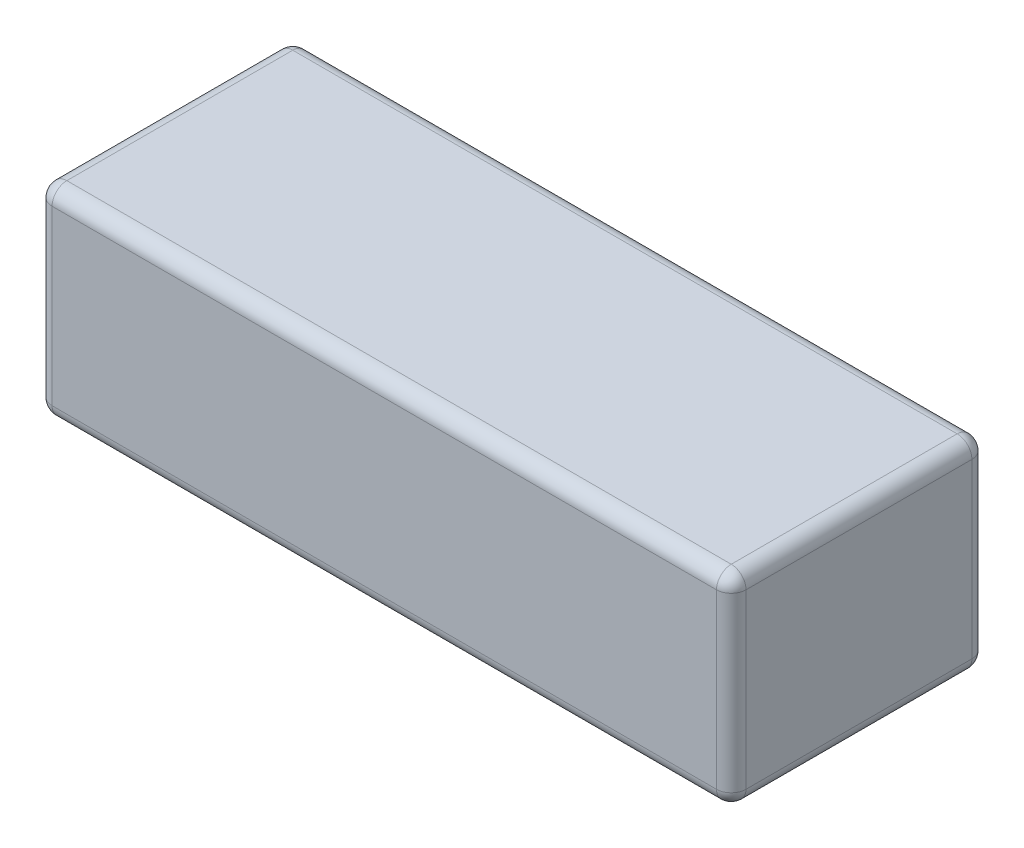
ISO-10303-21;
HEADER;
FILE_DESCRIPTION(('STEP AP214'),'2;1');
FILE_NAME('part.step','',(''),(''),'','','');
FILE_SCHEMA(('AUTOMOTIVE_DESIGN { 1 0 10303 214 1 1 1 1 }'));
ENDSEC;
DATA;
#1=APPLICATION_CONTEXT('core data for automotive mechanical design processes');
#2=APPLICATION_PROTOCOL_DEFINITION('international standard','automotive_design',2000,#1);
#3=PRODUCT_CONTEXT('',#1,'mechanical');
#4=PRODUCT('Part','Part','',(#3));
#5=PRODUCT_RELATED_PRODUCT_CATEGORY('part','',(#4));
#6=PRODUCT_DEFINITION_FORMATION('','',#4);
#7=PRODUCT_DEFINITION_CONTEXT('part definition',#1,'design');
#8=PRODUCT_DEFINITION('design','',#6,#7);
#9=PRODUCT_DEFINITION_SHAPE('','',#8);
#10=(LENGTH_UNIT() NAMED_UNIT(*) SI_UNIT(.MILLI.,.METRE.));
#11=(NAMED_UNIT(*) PLANE_ANGLE_UNIT() SI_UNIT($,.RADIAN.));
#12=(NAMED_UNIT(*) SI_UNIT($,.STERADIAN.) SOLID_ANGLE_UNIT());
#13=UNCERTAINTY_MEASURE_WITH_UNIT(LENGTH_MEASURE(1.E-05),#10,'distance_accuracy_value','');
#14=(GEOMETRIC_REPRESENTATION_CONTEXT(3) GLOBAL_UNCERTAINTY_ASSIGNED_CONTEXT((#13)) GLOBAL_UNIT_ASSIGNED_CONTEXT((#10,
#11,#12)) REPRESENTATION_CONTEXT('',''));
#15=CARTESIAN_POINT('',(0.,0.,0.));
#16=DIRECTION('',(0.,0.,1.));
#17=DIRECTION('',(1.,0.,0.));
#18=AXIS2_PLACEMENT_3D('',#15,#16,#17);
#19=CARTESIAN_POINT('',(23.5,13.7,8.65));
#20=DIRECTION('',(-1.,0.,0.));
#21=DIRECTION('',(0.,0.,1.));
#22=AXIS2_PLACEMENT_3D('',#19,#20,#21);
#23=PLANE('',#22);
#24=DIRECTION('',(0.,0.,-1.));
#25=VECTOR('',#24,1.);
#26=CARTESIAN_POINT('',(23.5,12.7,8.65));
#27=LINE('',#26,#25);
#28=CARTESIAN_POINT('',(23.5,12.7,-7.65));
#29=VERTEX_POINT('',#28);
#30=CARTESIAN_POINT('',(23.5,12.7,7.65));
#31=VERTEX_POINT('',#30);
#32=EDGE_CURVE('E132',#29,#31,#27,.F.);
#33=ORIENTED_EDGE('',*,*,#32,.T.);
#34=DIRECTION('',(0.,-1.,0.));
#35=VECTOR('',#34,1.);
#36=CARTESIAN_POINT('',(23.5,13.7,7.65));
#37=LINE('',#36,#35);
#38=CARTESIAN_POINT('',(23.5,0.999999999999999,7.65));
#39=VERTEX_POINT('',#38);
#40=EDGE_CURVE('E128',#31,#39,#37,.T.);
#41=ORIENTED_EDGE('',*,*,#40,.T.);
#42=DIRECTION('',(0.,0.,-1.));
#43=VECTOR('',#42,1.);
#44=CARTESIAN_POINT('',(23.5,0.999999999999999,-8.65));
#45=LINE('',#44,#43);
#46=CARTESIAN_POINT('',(23.5,0.999999999999999,-7.65));
#47=VERTEX_POINT('',#46);
#48=EDGE_CURVE('E123',#39,#47,#45,.T.);
#49=ORIENTED_EDGE('',*,*,#48,.T.);
#50=DIRECTION('',(0.,-1.,0.));
#51=VECTOR('',#50,1.);
#52=CARTESIAN_POINT('',(23.5,13.7,-7.65));
#53=LINE('',#52,#51);
#54=EDGE_CURVE('E125',#47,#29,#53,.F.);
#55=ORIENTED_EDGE('',*,*,#54,.T.);
#56=EDGE_LOOP('',(#33,#41,#49,#55));
#57=FACE_BOUND('',#56,.T.);
#58=ADVANCED_FACE('F34',(#57),#23,.F.);
#59=CARTESIAN_POINT('',(-23.5,13.7,-8.65));
#60=DIRECTION('',(0.,0.,1.));
#61=DIRECTION('',(1.,0.,0.));
#62=AXIS2_PLACEMENT_3D('',#59,#60,#61);
#63=PLANE('',#62);
#64=DIRECTION('',(-1.,0.,0.));
#65=VECTOR('',#64,1.);
#66=CARTESIAN_POINT('',(-23.5,12.7,-8.65));
#67=LINE('',#66,#65);
#68=CARTESIAN_POINT('',(-22.5,12.7,-8.65));
#69=VERTEX_POINT('',#68);
#70=CARTESIAN_POINT('',(22.5,12.7,-8.65));
#71=VERTEX_POINT('',#70);
#72=EDGE_CURVE('E43',#69,#71,#67,.F.);
#73=ORIENTED_EDGE('',*,*,#72,.T.);
#74=DIRECTION('',(0.,-1.,0.));
#75=VECTOR('',#74,1.);
#76=CARTESIAN_POINT('',(22.5,13.7,-8.65));
#77=LINE('',#76,#75);
#78=CARTESIAN_POINT('',(22.5,0.999999999999999,-8.65));
#79=VERTEX_POINT('',#78);
#80=EDGE_CURVE('E11',#71,#79,#77,.T.);
#81=ORIENTED_EDGE('',*,*,#80,.T.);
#82=DIRECTION('',(-1.,0.,0.));
#83=VECTOR('',#82,1.);
#84=CARTESIAN_POINT('',(-23.5,0.999999999999999,-8.65));
#85=LINE('',#84,#83);
#86=CARTESIAN_POINT('',(-22.5,0.999999999999999,-8.65));
#87=VERTEX_POINT('',#86);
#88=EDGE_CURVE('E234',#79,#87,#85,.T.);
#89=ORIENTED_EDGE('',*,*,#88,.T.);
#90=DIRECTION('',(0.,-1.,0.));
#91=VECTOR('',#90,1.);
#92=CARTESIAN_POINT('',(-22.5,13.7,-8.65));
#93=LINE('',#92,#91);
#94=EDGE_CURVE('E54',#87,#69,#93,.F.);
#95=ORIENTED_EDGE('',*,*,#94,.T.);
#96=EDGE_LOOP('',(#73,#81,#89,#95));
#97=FACE_BOUND('',#96,.T.);
#98=ADVANCED_FACE('F307',(#97),#63,.F.);
#99=CARTESIAN_POINT('',(-23.5,13.7,8.65));
#100=DIRECTION('',(1.,0.,0.));
#101=DIRECTION('',(0.,0.,-1.));
#102=AXIS2_PLACEMENT_3D('',#99,#100,#101);
#103=PLANE('',#102);
#104=DIRECTION('',(0.,0.,1.));
#105=VECTOR('',#104,1.);
#106=CARTESIAN_POINT('',(-23.5,0.999999999999999,8.65));
#107=LINE('',#106,#105);
#108=CARTESIAN_POINT('',(-23.5,0.999999999999999,-7.65));
#109=VERTEX_POINT('',#108);
#110=CARTESIAN_POINT('',(-23.5,0.999999999999999,7.65));
#111=VERTEX_POINT('',#110);
#112=EDGE_CURVE('E280',#109,#111,#107,.T.);
#113=ORIENTED_EDGE('',*,*,#112,.T.);
#114=DIRECTION('',(0.,-1.,0.));
#115=VECTOR('',#114,1.);
#116=CARTESIAN_POINT('',(-23.5,13.7,7.65));
#117=LINE('',#116,#115);
#118=CARTESIAN_POINT('',(-23.5,12.7,7.65));
#119=VERTEX_POINT('',#118);
#120=EDGE_CURVE('E283',#111,#119,#117,.F.);
#121=ORIENTED_EDGE('',*,*,#120,.T.);
#122=DIRECTION('',(0.,0.,1.));
#123=VECTOR('',#122,1.);
#124=CARTESIAN_POINT('',(-23.5,12.7,8.65));
#125=LINE('',#124,#123);
#126=CARTESIAN_POINT('',(-23.5,12.7,-7.65));
#127=VERTEX_POINT('',#126);
#128=EDGE_CURVE('E212',#119,#127,#125,.F.);
#129=ORIENTED_EDGE('',*,*,#128,.T.);
#130=DIRECTION('',(0.,-1.,0.));
#131=VECTOR('',#130,1.);
#132=CARTESIAN_POINT('',(-23.5,13.7,-7.65));
#133=LINE('',#132,#131);
#134=EDGE_CURVE('E264',#127,#109,#133,.T.);
#135=ORIENTED_EDGE('',*,*,#134,.T.);
#136=EDGE_LOOP('',(#113,#121,#129,#135));
#137=FACE_BOUND('',#136,.T.);
#138=ADVANCED_FACE('F312',(#137),#103,.F.);
#139=CARTESIAN_POINT('',(-23.5,13.7,8.65));
#140=DIRECTION('',(0.,0.,-1.));
#141=DIRECTION('',(-1.,0.,0.));
#142=AXIS2_PLACEMENT_3D('',#139,#140,#141);
#143=PLANE('',#142);
#144=DIRECTION('',(0.,-1.,0.));
#145=VECTOR('',#144,1.);
#146=CARTESIAN_POINT('',(22.5,13.7,8.65));
#147=LINE('',#146,#145);
#148=CARTESIAN_POINT('',(22.5,0.999999999999999,8.65));
#149=VERTEX_POINT('',#148);
#150=CARTESIAN_POINT('',(22.5,12.7,8.65));
#151=VERTEX_POINT('',#150);
#152=EDGE_CURVE('E265',#149,#151,#147,.F.);
#153=ORIENTED_EDGE('',*,*,#152,.T.);
#154=DIRECTION('',(1.,0.,0.));
#155=VECTOR('',#154,1.);
#156=CARTESIAN_POINT('',(-23.5,12.7,8.65));
#157=LINE('',#156,#155);
#158=CARTESIAN_POINT('',(-22.5,12.7,8.65));
#159=VERTEX_POINT('',#158);
#160=EDGE_CURVE('E259',#151,#159,#157,.F.);
#161=ORIENTED_EDGE('',*,*,#160,.T.);
#162=DIRECTION('',(0.,-1.,0.));
#163=VECTOR('',#162,1.);
#164=CARTESIAN_POINT('',(-22.5,13.7,8.65));
#165=LINE('',#164,#163);
#166=CARTESIAN_POINT('',(-22.5,0.999999999999999,8.65));
#167=VERTEX_POINT('',#166);
#168=EDGE_CURVE('E274',#159,#167,#165,.T.);
#169=ORIENTED_EDGE('',*,*,#168,.T.);
#170=DIRECTION('',(1.,0.,0.));
#171=VECTOR('',#170,1.);
#172=CARTESIAN_POINT('',(23.5,0.999999999999999,8.65));
#173=LINE('',#172,#171);
#174=EDGE_CURVE('E270',#167,#149,#173,.T.);
#175=ORIENTED_EDGE('',*,*,#174,.T.);
#176=EDGE_LOOP('',(#153,#161,#169,#175));
#177=FACE_BOUND('',#176,.T.);
#178=ADVANCED_FACE('F268',(#177),#143,.F.);
#179=CARTESIAN_POINT('',(0.,13.7,0.));
#180=DIRECTION('',(0.,-1.,0.));
#181=DIRECTION('',(0.,0.,-1.));
#182=AXIS2_PLACEMENT_3D('',#179,#180,#181);
#183=PLANE('',#182);
#184=DIRECTION('',(0.,0.,1.));
#185=VECTOR('',#184,1.);
#186=CARTESIAN_POINT('',(-22.5,13.7,0.));
#187=LINE('',#186,#185);
#188=CARTESIAN_POINT('',(-22.5,13.7,-7.65));
#189=VERTEX_POINT('',#188);
#190=CARTESIAN_POINT('',(-22.5,13.7,7.65));
#191=VERTEX_POINT('',#190);
#192=EDGE_CURVE('E214',#189,#191,#187,.T.);
#193=ORIENTED_EDGE('',*,*,#192,.T.);
#194=DIRECTION('',(1.,0.,0.));
#195=VECTOR('',#194,1.);
#196=CARTESIAN_POINT('',(0.,13.7,7.65));
#197=LINE('',#196,#195);
#198=CARTESIAN_POINT('',(22.5,13.7,7.65));
#199=VERTEX_POINT('',#198);
#200=EDGE_CURVE('E218',#191,#199,#197,.T.);
#201=ORIENTED_EDGE('',*,*,#200,.T.);
#202=DIRECTION('',(0.,0.,-1.));
#203=VECTOR('',#202,1.);
#204=CARTESIAN_POINT('',(22.5,13.7,0.));
#205=LINE('',#204,#203);
#206=CARTESIAN_POINT('',(22.5,13.7,-7.65));
#207=VERTEX_POINT('',#206);
#208=EDGE_CURVE('E219',#199,#207,#205,.T.);
#209=ORIENTED_EDGE('',*,*,#208,.T.);
#210=DIRECTION('',(-1.,0.,0.));
#211=VECTOR('',#210,1.);
#212=CARTESIAN_POINT('',(0.,13.7,-7.65));
#213=LINE('',#212,#211);
#214=EDGE_CURVE('E223',#207,#189,#213,.T.);
#215=ORIENTED_EDGE('',*,*,#214,.T.);
#216=EDGE_LOOP('',(#193,#201,#209,#215));
#217=FACE_BOUND('',#216,.T.);
#218=ADVANCED_FACE('F285',(#217),#183,.F.);
#219=CARTESIAN_POINT('',(0.,0.,0.));
#220=DIRECTION('',(0.,-1.,0.));
#221=DIRECTION('',(0.,0.,-1.));
#222=AXIS2_PLACEMENT_3D('',#219,#220,#221);
#223=PLANE('',#222);
#224=DIRECTION('',(1.,0.,0.));
#225=VECTOR('',#224,1.);
#226=CARTESIAN_POINT('',(-23.5,0.,7.65));
#227=LINE('',#226,#225);
#228=CARTESIAN_POINT('',(22.5,0.,7.65));
#229=VERTEX_POINT('',#228);
#230=CARTESIAN_POINT('',(-22.5,0.,7.65));
#231=VERTEX_POINT('',#230);
#232=EDGE_CURVE('E229',#229,#231,#227,.F.);
#233=ORIENTED_EDGE('',*,*,#232,.T.);
#234=DIRECTION('',(0.,0.,1.));
#235=VECTOR('',#234,1.);
#236=CARTESIAN_POINT('',(-22.5,0.,-8.65));
#237=LINE('',#236,#235);
#238=CARTESIAN_POINT('',(-22.5,0.,-7.65));
#239=VERTEX_POINT('',#238);
#240=EDGE_CURVE('E231',#231,#239,#237,.F.);
#241=ORIENTED_EDGE('',*,*,#240,.T.);
#242=DIRECTION('',(-1.,0.,0.));
#243=VECTOR('',#242,1.);
#244=CARTESIAN_POINT('',(23.5,0.,-7.65));
#245=LINE('',#244,#243);
#246=CARTESIAN_POINT('',(22.5,0.,-7.65));
#247=VERTEX_POINT('',#246);
#248=EDGE_CURVE('E221',#239,#247,#245,.F.);
#249=ORIENTED_EDGE('',*,*,#248,.T.);
#250=DIRECTION('',(0.,0.,-1.));
#251=VECTOR('',#250,1.);
#252=CARTESIAN_POINT('',(22.5,0.,8.65));
#253=LINE('',#252,#251);
#254=EDGE_CURVE('E153',#247,#229,#253,.F.);
#255=ORIENTED_EDGE('',*,*,#254,.T.);
#256=EDGE_LOOP('',(#233,#241,#249,#255));
#257=FACE_BOUND('',#256,.T.);
#258=ADVANCED_FACE('F339',(#257),#223,.T.);
#259=CARTESIAN_POINT('',(-22.5,13.7,-7.65));
#260=DIRECTION('',(0.,-1.,0.));
#261=DIRECTION('',(0.,0.,-1.));
#262=AXIS2_PLACEMENT_3D('',#259,#260,#261);
#263=CYLINDRICAL_SURFACE('',#262,1.);
#264=CARTESIAN_POINT('',(-22.5,12.7,-7.65));
#265=DIRECTION('',(0.,1.,0.));
#266=DIRECTION('',(0.,0.,1.));
#267=AXIS2_PLACEMENT_3D('',#264,#265,#266);
#268=CIRCLE('',#267,1.);
#269=EDGE_CURVE('E38',#69,#127,#268,.T.);
#270=ORIENTED_EDGE('',*,*,#269,.F.);
#271=ORIENTED_EDGE('',*,*,#94,.F.);
#272=CARTESIAN_POINT('',(-22.5,0.999999999999999,-7.65));
#273=DIRECTION('',(0.,-1.,0.));
#274=DIRECTION('',(0.,0.,-1.));
#275=AXIS2_PLACEMENT_3D('',#272,#273,#274);
#276=CIRCLE('',#275,1.);
#277=EDGE_CURVE('E194',#109,#87,#276,.T.);
#278=ORIENTED_EDGE('',*,*,#277,.F.);
#279=ORIENTED_EDGE('',*,*,#134,.F.);
#280=EDGE_LOOP('',(#270,#271,#278,#279));
#281=FACE_BOUND('',#280,.T.);
#282=ADVANCED_FACE('F36',(#281),#263,.T.);
#283=CARTESIAN_POINT('',(-22.5,12.7,-7.65));
#284=DIRECTION('',(0.,0.,1.));
#285=DIRECTION('',(1.,0.,0.));
#286=AXIS2_PLACEMENT_3D('',#283,#284,#285);
#287=SPHERICAL_SURFACE('',#286,1.);
#288=CARTESIAN_POINT('',(-22.5,12.7,-7.65));
#289=DIRECTION('',(-1.,0.,0.));
#290=DIRECTION('',(0.,0.,1.));
#291=AXIS2_PLACEMENT_3D('',#288,#289,#290);
#292=CIRCLE('',#291,1.);
#293=EDGE_CURVE('E189',#69,#189,#292,.F.);
#294=ORIENTED_EDGE('',*,*,#293,.F.);
#295=ORIENTED_EDGE('',*,*,#269,.T.);
#296=CARTESIAN_POINT('',(-22.5,12.7,-7.65));
#297=DIRECTION('',(0.,0.,-1.));
#298=DIRECTION('',(0.,1.,0.));
#299=AXIS2_PLACEMENT_3D('',#296,#297,#298);
#300=CIRCLE('',#299,1.);
#301=EDGE_CURVE('E192',#189,#127,#300,.F.);
#302=ORIENTED_EDGE('',*,*,#301,.F.);
#303=EDGE_LOOP('',(#294,#295,#302));
#304=FACE_BOUND('',#303,.T.);
#305=ADVANCED_FACE('F204',(#304),#287,.T.);
#306=CARTESIAN_POINT('',(-22.5,1.,-7.65));
#307=DIRECTION('',(0.,0.,1.));
#308=DIRECTION('',(1.,0.,0.));
#309=AXIS2_PLACEMENT_3D('',#306,#307,#308);
#310=SPHERICAL_SURFACE('',#309,1.);
#311=CARTESIAN_POINT('',(-22.5,1.,-7.65));
#312=DIRECTION('',(0.,0.,-1.));
#313=DIRECTION('',(-1.,0.,0.));
#314=AXIS2_PLACEMENT_3D('',#311,#312,#313);
#315=CIRCLE('',#314,1.);
#316=EDGE_CURVE('E183',#109,#239,#315,.F.);
#317=ORIENTED_EDGE('',*,*,#316,.F.);
#318=ORIENTED_EDGE('',*,*,#277,.T.);
#319=CARTESIAN_POINT('',(-22.5,0.999999999999999,-7.65));
#320=DIRECTION('',(-1.,0.,0.));
#321=DIRECTION('',(0.,0.,1.));
#322=AXIS2_PLACEMENT_3D('',#319,#320,#321);
#323=CIRCLE('',#322,1.);
#324=EDGE_CURVE('E186',#239,#87,#323,.F.);
#325=ORIENTED_EDGE('',*,*,#324,.F.);
#326=EDGE_LOOP('',(#317,#318,#325));
#327=FACE_BOUND('',#326,.T.);
#328=ADVANCED_FACE('F342',(#327),#310,.T.);
#329=CARTESIAN_POINT('',(-22.5,12.7,0.));
#330=DIRECTION('',(0.,0.,1.));
#331=DIRECTION('',(1.,0.,0.));
#332=AXIS2_PLACEMENT_3D('',#329,#330,#331);
#333=CYLINDRICAL_SURFACE('',#332,1.);
#334=ORIENTED_EDGE('',*,*,#301,.T.);
#335=ORIENTED_EDGE('',*,*,#128,.F.);
#336=CARTESIAN_POINT('',(-22.5,12.7,7.65));
#337=DIRECTION('',(0.,0.,1.));
#338=DIRECTION('',(1.,0.,0.));
#339=AXIS2_PLACEMENT_3D('',#336,#337,#338);
#340=CIRCLE('',#339,1.);
#341=EDGE_CURVE('E178',#191,#119,#340,.T.);
#342=ORIENTED_EDGE('',*,*,#341,.F.);
#343=ORIENTED_EDGE('',*,*,#192,.F.);
#344=EDGE_LOOP('',(#334,#335,#342,#343));
#345=FACE_BOUND('',#344,.T.);
#346=ADVANCED_FACE('F210',(#345),#333,.T.);
#347=CARTESIAN_POINT('',(0.,12.7,-7.65));
#348=DIRECTION('',(-1.,0.,0.));
#349=DIRECTION('',(0.,0.,1.));
#350=AXIS2_PLACEMENT_3D('',#347,#348,#349);
#351=CYLINDRICAL_SURFACE('',#350,1.);
#352=ORIENTED_EDGE('',*,*,#293,.T.);
#353=ORIENTED_EDGE('',*,*,#214,.F.);
#354=CARTESIAN_POINT('',(22.5,12.7,-7.65));
#355=DIRECTION('',(1.,0.,0.));
#356=DIRECTION('',(0.,1.,0.));
#357=AXIS2_PLACEMENT_3D('',#354,#355,#356);
#358=CIRCLE('',#357,1.);
#359=EDGE_CURVE('E175',#71,#207,#358,.T.);
#360=ORIENTED_EDGE('',*,*,#359,.F.);
#361=ORIENTED_EDGE('',*,*,#72,.F.);
#362=EDGE_LOOP('',(#352,#353,#360,#361));
#363=FACE_BOUND('',#362,.T.);
#364=ADVANCED_FACE('F288',(#363),#351,.T.);
#365=CARTESIAN_POINT('',(22.5,13.7,-7.65));
#366=DIRECTION('',(0.,-1.,0.));
#367=DIRECTION('',(0.,0.,-1.));
#368=AXIS2_PLACEMENT_3D('',#365,#366,#367);
#369=CYLINDRICAL_SURFACE('',#368,1.);
#370=CARTESIAN_POINT('',(22.5,0.999999999999999,-7.65));
#371=DIRECTION('',(0.,-1.,0.));
#372=DIRECTION('',(0.,0.,-1.));
#373=AXIS2_PLACEMENT_3D('',#370,#371,#372);
#374=CIRCLE('',#373,1.);
#375=EDGE_CURVE('E138',#79,#47,#374,.T.);
#376=ORIENTED_EDGE('',*,*,#375,.F.);
#377=ORIENTED_EDGE('',*,*,#80,.F.);
#378=CARTESIAN_POINT('',(22.5,12.7,-7.65));
#379=DIRECTION('',(0.,1.,0.));
#380=DIRECTION('',(0.,0.,1.));
#381=AXIS2_PLACEMENT_3D('',#378,#379,#380);
#382=CIRCLE('',#381,1.);
#383=EDGE_CURVE('E141',#29,#71,#382,.T.);
#384=ORIENTED_EDGE('',*,*,#383,.F.);
#385=ORIENTED_EDGE('',*,*,#54,.F.);
#386=EDGE_LOOP('',(#376,#377,#384,#385));
#387=FACE_BOUND('',#386,.T.);
#388=ADVANCED_FACE('F137',(#387),#369,.T.);
#389=CARTESIAN_POINT('',(-23.5,0.999999999999999,-7.65));
#390=DIRECTION('',(1.,0.,0.));
#391=DIRECTION('',(0.,0.,-1.));
#392=AXIS2_PLACEMENT_3D('',#389,#390,#391);
#393=CYLINDRICAL_SURFACE('',#392,1.);
#394=ORIENTED_EDGE('',*,*,#324,.T.);
#395=ORIENTED_EDGE('',*,*,#88,.F.);
#396=CARTESIAN_POINT('',(22.5,1.,-7.65));
#397=DIRECTION('',(1.,0.,0.));
#398=DIRECTION('',(0.,0.,-1.));
#399=AXIS2_PLACEMENT_3D('',#396,#397,#398);
#400=CIRCLE('',#399,1.);
#401=EDGE_CURVE('E150',#247,#79,#400,.T.);
#402=ORIENTED_EDGE('',*,*,#401,.F.);
#403=ORIENTED_EDGE('',*,*,#248,.F.);
#404=EDGE_LOOP('',(#394,#395,#402,#403));
#405=FACE_BOUND('',#404,.T.);
#406=ADVANCED_FACE('F341',(#405),#393,.T.);
#407=CARTESIAN_POINT('',(-22.5,0.999999999999999,8.65));
#408=DIRECTION('',(0.,0.,-1.));
#409=DIRECTION('',(-1.,0.,0.));
#410=AXIS2_PLACEMENT_3D('',#407,#408,#409);
#411=CYLINDRICAL_SURFACE('',#410,1.);
#412=ORIENTED_EDGE('',*,*,#316,.T.);
#413=ORIENTED_EDGE('',*,*,#240,.F.);
#414=CARTESIAN_POINT('',(-22.5,0.999999999999999,7.65));
#415=DIRECTION('',(0.,0.,1.));
#416=DIRECTION('',(1.,0.,0.));
#417=AXIS2_PLACEMENT_3D('',#414,#415,#416);
#418=CIRCLE('',#417,1.);
#419=EDGE_CURVE('E170',#111,#231,#418,.T.);
#420=ORIENTED_EDGE('',*,*,#419,.F.);
#421=ORIENTED_EDGE('',*,*,#112,.F.);
#422=EDGE_LOOP('',(#412,#413,#420,#421));
#423=FACE_BOUND('',#422,.T.);
#424=ADVANCED_FACE('F337',(#423),#411,.T.);
#425=CARTESIAN_POINT('',(-22.5,13.7,7.65));
#426=DIRECTION('',(0.,-1.,0.));
#427=DIRECTION('',(0.,0.,-1.));
#428=AXIS2_PLACEMENT_3D('',#425,#426,#427);
#429=CYLINDRICAL_SURFACE('',#428,1.);
#430=CARTESIAN_POINT('',(-22.5,12.7,7.65));
#431=DIRECTION('',(0.,1.,0.));
#432=DIRECTION('',(0.,0.,1.));
#433=AXIS2_PLACEMENT_3D('',#430,#431,#432);
#434=CIRCLE('',#433,1.);
#435=EDGE_CURVE('E180',#119,#159,#434,.T.);
#436=ORIENTED_EDGE('',*,*,#435,.F.);
#437=ORIENTED_EDGE('',*,*,#120,.F.);
#438=CARTESIAN_POINT('',(-22.5,0.999999999999999,7.65));
#439=DIRECTION('',(0.,-1.,0.));
#440=DIRECTION('',(0.,0.,-1.));
#441=AXIS2_PLACEMENT_3D('',#438,#439,#440);
#442=CIRCLE('',#441,1.);
#443=EDGE_CURVE('E167',#167,#111,#442,.T.);
#444=ORIENTED_EDGE('',*,*,#443,.F.);
#445=ORIENTED_EDGE('',*,*,#168,.F.);
#446=EDGE_LOOP('',(#436,#437,#444,#445));
#447=FACE_BOUND('',#446,.T.);
#448=ADVANCED_FACE('F359',(#447),#429,.T.);
#449=CARTESIAN_POINT('',(-22.5,12.7,7.65));
#450=DIRECTION('',(0.,0.,1.));
#451=DIRECTION('',(1.,0.,0.));
#452=AXIS2_PLACEMENT_3D('',#449,#450,#451);
#453=SPHERICAL_SURFACE('',#452,1.);
#454=ORIENTED_EDGE('',*,*,#341,.T.);
#455=ORIENTED_EDGE('',*,*,#435,.T.);
#456=CARTESIAN_POINT('',(-22.5,12.7,7.65));
#457=DIRECTION('',(-1.,0.,0.));
#458=DIRECTION('',(0.,0.,1.));
#459=AXIS2_PLACEMENT_3D('',#456,#457,#458);
#460=CIRCLE('',#459,1.);
#461=EDGE_CURVE('E158',#191,#159,#460,.F.);
#462=ORIENTED_EDGE('',*,*,#461,.F.);
#463=EDGE_LOOP('',(#454,#455,#462));
#464=FACE_BOUND('',#463,.T.);
#465=ADVANCED_FACE('F362',(#464),#453,.T.);
#466=CARTESIAN_POINT('',(22.5,12.7,-7.65));
#467=DIRECTION('',(0.,0.,1.));
#468=DIRECTION('',(1.,0.,0.));
#469=AXIS2_PLACEMENT_3D('',#466,#467,#468);
#470=SPHERICAL_SURFACE('',#469,1.);
#471=ORIENTED_EDGE('',*,*,#383,.T.);
#472=ORIENTED_EDGE('',*,*,#359,.T.);
#473=CARTESIAN_POINT('',(22.5,12.7,-7.65));
#474=DIRECTION('',(0.,0.,-1.));
#475=DIRECTION('',(-1.,0.,0.));
#476=AXIS2_PLACEMENT_3D('',#473,#474,#475);
#477=CIRCLE('',#476,1.);
#478=EDGE_CURVE('E154',#29,#207,#477,.F.);
#479=ORIENTED_EDGE('',*,*,#478,.F.);
#480=EDGE_LOOP('',(#471,#472,#479));
#481=FACE_BOUND('',#480,.T.);
#482=ADVANCED_FACE('F290',(#481),#470,.T.);
#483=CARTESIAN_POINT('',(22.5,1.,-7.65));
#484=DIRECTION('',(0.,0.,1.));
#485=DIRECTION('',(1.,0.,0.));
#486=AXIS2_PLACEMENT_3D('',#483,#484,#485);
#487=SPHERICAL_SURFACE('',#486,1.);
#488=ORIENTED_EDGE('',*,*,#401,.T.);
#489=ORIENTED_EDGE('',*,*,#375,.T.);
#490=CARTESIAN_POINT('',(22.5,0.999999999999999,-7.65));
#491=DIRECTION('',(0.,0.,-1.));
#492=DIRECTION('',(-1.,0.,0.));
#493=AXIS2_PLACEMENT_3D('',#490,#491,#492);
#494=CIRCLE('',#493,1.);
#495=EDGE_CURVE('E147',#247,#47,#494,.F.);
#496=ORIENTED_EDGE('',*,*,#495,.F.);
#497=EDGE_LOOP('',(#488,#489,#496));
#498=FACE_BOUND('',#497,.T.);
#499=ADVANCED_FACE('F146',(#498),#487,.T.);
#500=CARTESIAN_POINT('',(-22.5,1.,7.65));
#501=DIRECTION('',(0.,0.,1.));
#502=DIRECTION('',(1.,0.,0.));
#503=AXIS2_PLACEMENT_3D('',#500,#501,#502);
#504=SPHERICAL_SURFACE('',#503,1.);
#505=ORIENTED_EDGE('',*,*,#443,.T.);
#506=ORIENTED_EDGE('',*,*,#419,.T.);
#507=CARTESIAN_POINT('',(-22.5,1.,7.65));
#508=DIRECTION('',(-1.,0.,0.));
#509=DIRECTION('',(0.,0.,1.));
#510=AXIS2_PLACEMENT_3D('',#507,#508,#509);
#511=CIRCLE('',#510,1.);
#512=EDGE_CURVE('E155',#167,#231,#511,.F.);
#513=ORIENTED_EDGE('',*,*,#512,.F.);
#514=EDGE_LOOP('',(#505,#506,#513));
#515=FACE_BOUND('',#514,.T.);
#516=ADVANCED_FACE('F304',(#515),#504,.T.);
#517=CARTESIAN_POINT('',(0.,12.7,7.65));
#518=DIRECTION('',(1.,0.,0.));
#519=DIRECTION('',(0.,0.,-1.));
#520=AXIS2_PLACEMENT_3D('',#517,#518,#519);
#521=CYLINDRICAL_SURFACE('',#520,1.);
#522=ORIENTED_EDGE('',*,*,#461,.T.);
#523=ORIENTED_EDGE('',*,*,#160,.F.);
#524=CARTESIAN_POINT('',(22.5,12.7,7.65));
#525=DIRECTION('',(1.,0.,0.));
#526=DIRECTION('',(0.,0.,-1.));
#527=AXIS2_PLACEMENT_3D('',#524,#525,#526);
#528=CIRCLE('',#527,1.);
#529=EDGE_CURVE('E161',#199,#151,#528,.T.);
#530=ORIENTED_EDGE('',*,*,#529,.F.);
#531=ORIENTED_EDGE('',*,*,#200,.F.);
#532=EDGE_LOOP('',(#522,#523,#530,#531));
#533=FACE_BOUND('',#532,.T.);
#534=ADVANCED_FACE('F261',(#533),#521,.T.);
#535=CARTESIAN_POINT('',(22.5,12.7,0.));
#536=DIRECTION('',(0.,0.,-1.));
#537=DIRECTION('',(-1.,0.,0.));
#538=AXIS2_PLACEMENT_3D('',#535,#536,#537);
#539=CYLINDRICAL_SURFACE('',#538,1.);
#540=ORIENTED_EDGE('',*,*,#478,.T.);
#541=ORIENTED_EDGE('',*,*,#208,.F.);
#542=CARTESIAN_POINT('',(22.5,12.7,7.65));
#543=DIRECTION('',(0.,0.,1.));
#544=DIRECTION('',(1.,0.,0.));
#545=AXIS2_PLACEMENT_3D('',#542,#543,#544);
#546=CIRCLE('',#545,1.);
#547=EDGE_CURVE('E248',#31,#199,#546,.T.);
#548=ORIENTED_EDGE('',*,*,#547,.F.);
#549=ORIENTED_EDGE('',*,*,#32,.F.);
#550=EDGE_LOOP('',(#540,#541,#548,#549));
#551=FACE_BOUND('',#550,.T.);
#552=ADVANCED_FACE('F293',(#551),#539,.T.);
#553=CARTESIAN_POINT('',(22.5,0.999999999999999,8.65));
#554=DIRECTION('',(0.,0.,1.));
#555=DIRECTION('',(1.,0.,0.));
#556=AXIS2_PLACEMENT_3D('',#553,#554,#555);
#557=CYLINDRICAL_SURFACE('',#556,1.);
#558=ORIENTED_EDGE('',*,*,#495,.T.);
#559=ORIENTED_EDGE('',*,*,#48,.F.);
#560=CARTESIAN_POINT('',(22.5,1.,7.65));
#561=DIRECTION('',(0.,0.,1.));
#562=DIRECTION('',(1.,0.,0.));
#563=AXIS2_PLACEMENT_3D('',#560,#561,#562);
#564=CIRCLE('',#563,1.);
#565=EDGE_CURVE('E245',#229,#39,#564,.T.);
#566=ORIENTED_EDGE('',*,*,#565,.F.);
#567=ORIENTED_EDGE('',*,*,#254,.F.);
#568=EDGE_LOOP('',(#558,#559,#566,#567));
#569=FACE_BOUND('',#568,.T.);
#570=ADVANCED_FACE('F152',(#569),#557,.T.);
#571=CARTESIAN_POINT('',(-23.5,0.999999999999999,7.65));
#572=DIRECTION('',(-1.,0.,0.));
#573=DIRECTION('',(0.,0.,1.));
#574=AXIS2_PLACEMENT_3D('',#571,#572,#573);
#575=CYLINDRICAL_SURFACE('',#574,1.);
#576=ORIENTED_EDGE('',*,*,#512,.T.);
#577=ORIENTED_EDGE('',*,*,#232,.F.);
#578=CARTESIAN_POINT('',(22.5,0.999999999999999,7.65));
#579=DIRECTION('',(1.,0.,0.));
#580=DIRECTION('',(0.,0.,-1.));
#581=AXIS2_PLACEMENT_3D('',#578,#579,#580);
#582=CIRCLE('',#581,1.);
#583=EDGE_CURVE('E242',#149,#229,#582,.T.);
#584=ORIENTED_EDGE('',*,*,#583,.F.);
#585=ORIENTED_EDGE('',*,*,#174,.F.);
#586=EDGE_LOOP('',(#576,#577,#584,#585));
#587=FACE_BOUND('',#586,.T.);
#588=ADVANCED_FACE('F302',(#587),#575,.T.);
#589=CARTESIAN_POINT('',(22.5,12.7,7.65));
#590=DIRECTION('',(0.,0.,1.));
#591=DIRECTION('',(1.,0.,0.));
#592=AXIS2_PLACEMENT_3D('',#589,#590,#591);
#593=SPHERICAL_SURFACE('',#592,1.);
#594=ORIENTED_EDGE('',*,*,#547,.T.);
#595=ORIENTED_EDGE('',*,*,#529,.T.);
#596=CARTESIAN_POINT('',(22.5,12.7,7.65));
#597=DIRECTION('',(0.,1.,0.));
#598=DIRECTION('',(0.,0.,1.));
#599=AXIS2_PLACEMENT_3D('',#596,#597,#598);
#600=CIRCLE('',#599,1.);
#601=EDGE_CURVE('E240',#31,#151,#600,.F.);
#602=ORIENTED_EDGE('',*,*,#601,.F.);
#603=EDGE_LOOP('',(#594,#595,#602));
#604=FACE_BOUND('',#603,.T.);
#605=ADVANCED_FACE('F254',(#604),#593,.T.);
#606=CARTESIAN_POINT('',(22.5,1.,7.65));
#607=DIRECTION('',(0.,0.,1.));
#608=DIRECTION('',(1.,0.,0.));
#609=AXIS2_PLACEMENT_3D('',#606,#607,#608);
#610=SPHERICAL_SURFACE('',#609,1.);
#611=ORIENTED_EDGE('',*,*,#583,.T.);
#612=ORIENTED_EDGE('',*,*,#565,.T.);
#613=CARTESIAN_POINT('',(22.5,0.999999999999999,7.65));
#614=DIRECTION('',(0.,-1.,0.));
#615=DIRECTION('',(0.,0.,-1.));
#616=AXIS2_PLACEMENT_3D('',#613,#614,#615);
#617=CIRCLE('',#616,1.);
#618=EDGE_CURVE('E238',#149,#39,#617,.F.);
#619=ORIENTED_EDGE('',*,*,#618,.F.);
#620=EDGE_LOOP('',(#611,#612,#619));
#621=FACE_BOUND('',#620,.T.);
#622=ADVANCED_FACE('F319',(#621),#610,.T.);
#623=CARTESIAN_POINT('',(22.5,13.7,7.65));
#624=DIRECTION('',(0.,-1.,0.));
#625=DIRECTION('',(0.,0.,-1.));
#626=AXIS2_PLACEMENT_3D('',#623,#624,#625);
#627=CYLINDRICAL_SURFACE('',#626,1.);
#628=ORIENTED_EDGE('',*,*,#601,.T.);
#629=ORIENTED_EDGE('',*,*,#152,.F.);
#630=ORIENTED_EDGE('',*,*,#618,.T.);
#631=ORIENTED_EDGE('',*,*,#40,.F.);
#632=EDGE_LOOP('',(#628,#629,#630,#631));
#633=FACE_BOUND('',#632,.T.);
#634=ADVANCED_FACE('F316',(#633),#627,.T.);
#635=CLOSED_SHELL('',(#58,#98,#138,#178,#218,#258,#282,#305,#328,#346,#364,#388,#406,#424,#448,
#465,#482,#499,#516,#534,#552,#570,#588,#605,#622,#634));
#636=MANIFOLD_SOLID_BREP('B2',#635);
#637=ADVANCED_BREP_SHAPE_REPRESENTATION('',(#18,#636),#14);
#638=SHAPE_DEFINITION_REPRESENTATION(#9,#637);
ENDSEC;
END-ISO-10303-21;
